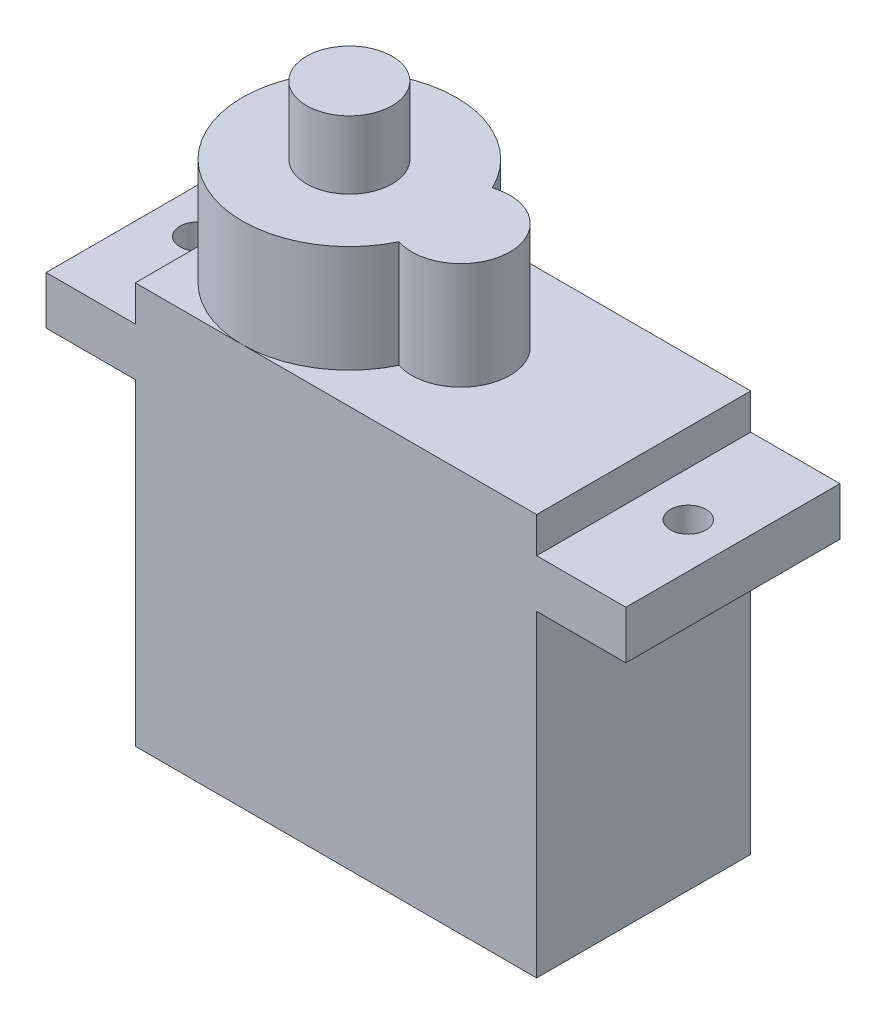
ISO-10303-21;
HEADER;
FILE_DESCRIPTION(('STEP AP214'),'2;1');
FILE_NAME('part.step','',(''),(''),'','','');
FILE_SCHEMA(('AUTOMOTIVE_DESIGN { 1 0 10303 214 1 1 1 1 }'));
ENDSEC;
DATA;
#1=APPLICATION_CONTEXT('core data for automotive mechanical design processes');
#2=APPLICATION_PROTOCOL_DEFINITION('international standard','automotive_design',2000,#1);
#3=PRODUCT_CONTEXT('',#1,'mechanical');
#4=PRODUCT('Part','Part','',(#3));
#5=PRODUCT_RELATED_PRODUCT_CATEGORY('part','',(#4));
#6=PRODUCT_DEFINITION_FORMATION('','',#4);
#7=PRODUCT_DEFINITION_CONTEXT('part definition',#1,'design');
#8=PRODUCT_DEFINITION('design','',#6,#7);
#9=PRODUCT_DEFINITION_SHAPE('','',#8);
#10=(LENGTH_UNIT() NAMED_UNIT(*) SI_UNIT(.MILLI.,.METRE.));
#11=(NAMED_UNIT(*) PLANE_ANGLE_UNIT() SI_UNIT($,.RADIAN.));
#12=(NAMED_UNIT(*) SI_UNIT($,.STERADIAN.) SOLID_ANGLE_UNIT());
#13=UNCERTAINTY_MEASURE_WITH_UNIT(LENGTH_MEASURE(1.E-05),#10,'distance_accuracy_value','');
#14=(GEOMETRIC_REPRESENTATION_CONTEXT(3) GLOBAL_UNCERTAINTY_ASSIGNED_CONTEXT((#13)) GLOBAL_UNIT_ASSIGNED_CONTEXT((#10,
#11,#12)) REPRESENTATION_CONTEXT('',''));
#15=CARTESIAN_POINT('',(0.,0.,0.));
#16=DIRECTION('',(0.,0.,1.));
#17=DIRECTION('',(1.,0.,0.));
#18=AXIS2_PLACEMENT_3D('',#15,#16,#17);
#19=CARTESIAN_POINT('',(11.25,11.25,-12.));
#20=DIRECTION('',(0.,1.,0.));
#21=DIRECTION('',(-1.,0.,0.));
#22=AXIS2_PLACEMENT_3D('',#19,#20,#21);
#23=PLANE('',#22);
#24=CARTESIAN_POINT('',(-5.25,11.25,-6.));
#25=DIRECTION('',(0.,1.,0.));
#26=DIRECTION('',(-1.,0.,0.));
#27=AXIS2_PLACEMENT_3D('',#24,#25,#26);
#28=CIRCLE('',#27,6.);
#29=CARTESIAN_POINT('',(0.150000000000006,11.25,-8.6153393661244));
#30=VERTEX_POINT('',#29);
#31=CARTESIAN_POINT('',(-5.25,11.25,-12.));
#32=VERTEX_POINT('',#31);
#33=EDGE_CURVE('E48',#30,#32,#28,.T.);
#34=ORIENTED_EDGE('',*,*,#33,.F.);
#35=CARTESIAN_POINT('',(1.,11.25,-6.));
#36=DIRECTION('',(0.,1.,0.));
#37=DIRECTION('',(-1.,0.,0.));
#38=AXIS2_PLACEMENT_3D('',#35,#36,#37);
#39=CIRCLE('',#38,2.75);
#40=CARTESIAN_POINT('',(0.150000000000005,11.25,-3.3846606338756));
#41=VERTEX_POINT('',#40);
#42=EDGE_CURVE('E55',#41,#30,#39,.T.);
#43=ORIENTED_EDGE('',*,*,#42,.F.);
#44=CARTESIAN_POINT('',(-5.25,11.25,0.));
#45=VERTEX_POINT('',#44);
#46=EDGE_CURVE('E166',#45,#41,#28,.T.);
#47=ORIENTED_EDGE('',*,*,#46,.F.);
#48=DIRECTION('',(-1.,0.,0.));
#49=VECTOR('',#48,1.);
#50=CARTESIAN_POINT('',(11.25,11.25,0.));
#51=LINE('',#50,#49);
#52=CARTESIAN_POINT('',(11.25,11.25,0.));
#53=VERTEX_POINT('',#52);
#54=EDGE_CURVE('E258',#53,#45,#51,.T.);
#55=ORIENTED_EDGE('',*,*,#54,.F.);
#56=DIRECTION('',(0.,0.,1.));
#57=VECTOR('',#56,1.);
#58=CARTESIAN_POINT('',(11.25,11.25,-12.));
#59=LINE('',#58,#57);
#60=CARTESIAN_POINT('',(11.25,11.25,-12.));
#61=VERTEX_POINT('',#60);
#62=EDGE_CURVE('E265',#61,#53,#59,.T.);
#63=ORIENTED_EDGE('',*,*,#62,.F.);
#64=DIRECTION('',(-1.,0.,0.));
#65=VECTOR('',#64,1.);
#66=CARTESIAN_POINT('',(11.25,11.25,-12.));
#67=LINE('',#66,#65);
#68=EDGE_CURVE('E243',#61,#32,#67,.T.);
#69=ORIENTED_EDGE('',*,*,#68,.T.);
#70=EDGE_LOOP('',(#34,#43,#47,#55,#63,#69));
#71=FACE_BOUND('',#70,.T.);
#72=ADVANCED_FACE('F37',(#71),#23,.T.);
#73=CARTESIAN_POINT('',(-11.25,11.25,-6.));
#74=VERTEX_POINT('',#73);
#75=EDGE_CURVE('E11',#32,#74,#28,.T.);
#76=ORIENTED_EDGE('',*,*,#75,.F.);
#77=CARTESIAN_POINT('',(-11.25,11.25,-12.));
#78=VERTEX_POINT('',#77);
#79=EDGE_CURVE('E242',#32,#78,#67,.T.);
#80=ORIENTED_EDGE('',*,*,#79,.T.);
#81=DIRECTION('',(0.,0.,1.));
#82=VECTOR('',#81,1.);
#83=CARTESIAN_POINT('',(-11.25,11.25,-12.));
#84=LINE('',#83,#82);
#85=EDGE_CURVE('E261',#78,#74,#84,.T.);
#86=ORIENTED_EDGE('',*,*,#85,.T.);
#87=EDGE_LOOP('',(#76,#80,#86));
#88=FACE_BOUND('',#87,.T.);
#89=ADVANCED_FACE('F337',(#88),#23,.T.);
#90=CARTESIAN_POINT('',(-11.25,-11.25,-12.));
#91=DIRECTION('',(-1.,0.,0.));
#92=DIRECTION('',(0.,0.,1.));
#93=AXIS2_PLACEMENT_3D('',#90,#91,#92);
#94=PLANE('',#93);
#95=DIRECTION('',(0.,-1.,0.));
#96=VECTOR('',#95,1.);
#97=CARTESIAN_POINT('',(-11.25,-11.25,0.));
#98=LINE('',#97,#96);
#99=CARTESIAN_POINT('',(-11.25,6.54999999999999,0.));
#100=VERTEX_POINT('',#99);
#101=CARTESIAN_POINT('',(-11.25,-11.25,0.));
#102=VERTEX_POINT('',#101);
#103=EDGE_CURVE('E231',#100,#102,#98,.T.);
#104=ORIENTED_EDGE('',*,*,#103,.F.);
#105=DIRECTION('',(0.,0.,-1.));
#106=VECTOR('',#105,1.);
#107=CARTESIAN_POINT('',(-11.25,6.55,0.));
#108=LINE('',#107,#106);
#109=CARTESIAN_POINT('',(-11.25,6.55,-12.));
#110=VERTEX_POINT('',#109);
#111=EDGE_CURVE('E187',#100,#110,#108,.T.);
#112=ORIENTED_EDGE('',*,*,#111,.T.);
#113=DIRECTION('',(0.,-1.,0.));
#114=VECTOR('',#113,1.);
#115=CARTESIAN_POINT('',(-11.25,-11.25,-12.));
#116=LINE('',#115,#114);
#117=CARTESIAN_POINT('',(-11.25,-11.25,-12.));
#118=VERTEX_POINT('',#117);
#119=EDGE_CURVE('E236',#110,#118,#116,.T.);
#120=ORIENTED_EDGE('',*,*,#119,.T.);
#121=DIRECTION('',(0.,0.,1.));
#122=VECTOR('',#121,1.);
#123=CARTESIAN_POINT('',(-11.25,-11.25,-12.));
#124=LINE('',#123,#122);
#125=EDGE_CURVE('E246',#118,#102,#124,.T.);
#126=ORIENTED_EDGE('',*,*,#125,.T.);
#127=EDGE_LOOP('',(#104,#112,#120,#126));
#128=FACE_BOUND('',#127,.T.);
#129=ADVANCED_FACE('F39',(#128),#94,.T.);
#130=CARTESIAN_POINT('',(-11.25,9.24999999999999,-12.));
#131=VERTEX_POINT('',#130);
#132=EDGE_CURVE('E232',#78,#131,#116,.T.);
#133=ORIENTED_EDGE('',*,*,#132,.T.);
#134=DIRECTION('',(0.,0.,1.));
#135=VECTOR('',#134,1.);
#136=CARTESIAN_POINT('',(-11.25,9.25,0.));
#137=LINE('',#136,#135);
#138=CARTESIAN_POINT('',(-11.25,9.24999999999998,0.));
#139=VERTEX_POINT('',#138);
#140=EDGE_CURVE('E179',#131,#139,#137,.T.);
#141=ORIENTED_EDGE('',*,*,#140,.T.);
#142=CARTESIAN_POINT('',(-11.25,11.25,0.));
#143=VERTEX_POINT('',#142);
#144=EDGE_CURVE('E247',#143,#139,#98,.T.);
#145=ORIENTED_EDGE('',*,*,#144,.F.);
#146=EDGE_CURVE('E264',#74,#143,#84,.T.);
#147=ORIENTED_EDGE('',*,*,#146,.F.);
#148=ORIENTED_EDGE('',*,*,#85,.F.);
#149=EDGE_LOOP('',(#133,#141,#145,#147,#148));
#150=FACE_BOUND('',#149,.T.);
#151=ADVANCED_FACE('F351',(#150),#94,.T.);
#152=CARTESIAN_POINT('',(11.25,-11.25,-12.));
#153=DIRECTION('',(1.,0.,0.));
#154=DIRECTION('',(0.,0.,-1.));
#155=AXIS2_PLACEMENT_3D('',#152,#153,#154);
#156=PLANE('',#155);
#157=DIRECTION('',(0.,0.,1.));
#158=VECTOR('',#157,1.);
#159=CARTESIAN_POINT('',(11.25,9.25,0.));
#160=LINE('',#159,#158);
#161=CARTESIAN_POINT('',(11.25,9.24999999999999,-12.));
#162=VERTEX_POINT('',#161);
#163=CARTESIAN_POINT('',(11.25,9.24999999999999,0.));
#164=VERTEX_POINT('',#163);
#165=EDGE_CURVE('E208',#162,#164,#160,.T.);
#166=ORIENTED_EDGE('',*,*,#165,.F.);
#167=DIRECTION('',(0.,1.,0.));
#168=VECTOR('',#167,1.);
#169=CARTESIAN_POINT('',(11.25,-11.25,-12.));
#170=LINE('',#169,#168);
#171=EDGE_CURVE('E239',#162,#61,#170,.T.);
#172=ORIENTED_EDGE('',*,*,#171,.T.);
#173=ORIENTED_EDGE('',*,*,#62,.T.);
#174=DIRECTION('',(0.,1.,0.));
#175=VECTOR('',#174,1.);
#176=CARTESIAN_POINT('',(11.25,-11.25,0.));
#177=LINE('',#176,#175);
#178=EDGE_CURVE('E253',#164,#53,#177,.T.);
#179=ORIENTED_EDGE('',*,*,#178,.F.);
#180=EDGE_LOOP('',(#166,#172,#173,#179));
#181=FACE_BOUND('',#180,.T.);
#182=ADVANCED_FACE('F308',(#181),#156,.T.);
#183=EDGE_CURVE('E46',#74,#45,#28,.T.);
#184=ORIENTED_EDGE('',*,*,#183,.F.);
#185=ORIENTED_EDGE('',*,*,#146,.T.);
#186=EDGE_CURVE('E257',#45,#143,#51,.T.);
#187=ORIENTED_EDGE('',*,*,#186,.F.);
#188=EDGE_LOOP('',(#184,#185,#187));
#189=FACE_BOUND('',#188,.T.);
#190=ADVANCED_FACE('F339',(#189),#23,.T.);
#191=DIRECTION('',(0.,0.,-1.));
#192=VECTOR('',#191,1.);
#193=CARTESIAN_POINT('',(11.25,6.55,0.));
#194=LINE('',#193,#192);
#195=CARTESIAN_POINT('',(11.25,6.54999999999999,0.));
#196=VERTEX_POINT('',#195);
#197=CARTESIAN_POINT('',(11.25,6.55,-12.));
#198=VERTEX_POINT('',#197);
#199=EDGE_CURVE('E215',#196,#198,#194,.T.);
#200=ORIENTED_EDGE('',*,*,#199,.F.);
#201=CARTESIAN_POINT('',(11.25,-11.25,0.));
#202=VERTEX_POINT('',#201);
#203=EDGE_CURVE('E254',#202,#196,#177,.T.);
#204=ORIENTED_EDGE('',*,*,#203,.F.);
#205=DIRECTION('',(0.,0.,1.));
#206=VECTOR('',#205,1.);
#207=CARTESIAN_POINT('',(11.25,-11.25,-12.));
#208=LINE('',#207,#206);
#209=CARTESIAN_POINT('',(11.25,-11.25,-12.));
#210=VERTEX_POINT('',#209);
#211=EDGE_CURVE('E268',#210,#202,#208,.T.);
#212=ORIENTED_EDGE('',*,*,#211,.F.);
#213=EDGE_CURVE('E240',#210,#198,#170,.T.);
#214=ORIENTED_EDGE('',*,*,#213,.T.);
#215=EDGE_LOOP('',(#200,#204,#212,#214));
#216=FACE_BOUND('',#215,.T.);
#217=ADVANCED_FACE('F295',(#216),#156,.T.);
#218=CARTESIAN_POINT('',(11.25,-11.25,-12.));
#219=DIRECTION('',(0.,-1.,0.));
#220=DIRECTION('',(1.,0.,0.));
#221=AXIS2_PLACEMENT_3D('',#218,#219,#220);
#222=PLANE('',#221);
#223=DIRECTION('',(1.,0.,0.));
#224=VECTOR('',#223,1.);
#225=CARTESIAN_POINT('',(11.25,-11.25,0.));
#226=LINE('',#225,#224);
#227=EDGE_CURVE('E250',#102,#202,#226,.T.);
#228=ORIENTED_EDGE('',*,*,#227,.F.);
#229=ORIENTED_EDGE('',*,*,#125,.F.);
#230=DIRECTION('',(1.,0.,0.));
#231=VECTOR('',#230,1.);
#232=CARTESIAN_POINT('',(11.25,-11.25,-12.));
#233=LINE('',#232,#231);
#234=EDGE_CURVE('E235',#118,#210,#233,.T.);
#235=ORIENTED_EDGE('',*,*,#234,.T.);
#236=ORIENTED_EDGE('',*,*,#211,.T.);
#237=EDGE_LOOP('',(#228,#229,#235,#236));
#238=FACE_BOUND('',#237,.T.);
#239=ADVANCED_FACE('F277',(#238),#222,.T.);
#240=CARTESIAN_POINT('',(0.,0.,-12.));
#241=DIRECTION('',(0.,0.,1.));
#242=DIRECTION('',(1.,0.,0.));
#243=AXIS2_PLACEMENT_3D('',#240,#241,#242);
#244=PLANE('',#243);
#245=DIRECTION('',(-1.,0.,0.));
#246=VECTOR('',#245,1.);
#247=CARTESIAN_POINT('',(16.25,6.55,-12.));
#248=LINE('',#247,#246);
#249=CARTESIAN_POINT('',(16.25,6.55,-12.));
#250=VERTEX_POINT('',#249);
#251=EDGE_CURVE('E225',#250,#198,#248,.T.);
#252=ORIENTED_EDGE('',*,*,#251,.T.);
#253=ORIENTED_EDGE('',*,*,#213,.F.);
#254=ORIENTED_EDGE('',*,*,#234,.F.);
#255=ORIENTED_EDGE('',*,*,#119,.F.);
#256=DIRECTION('',(1.,0.,0.));
#257=VECTOR('',#256,1.);
#258=CARTESIAN_POINT('',(-16.25,6.55,-12.));
#259=LINE('',#258,#257);
#260=CARTESIAN_POINT('',(-16.25,6.55,-12.));
#261=VERTEX_POINT('',#260);
#262=EDGE_CURVE('E195',#261,#110,#259,.T.);
#263=ORIENTED_EDGE('',*,*,#262,.F.);
#264=DIRECTION('',(0.,1.,0.));
#265=VECTOR('',#264,1.);
#266=CARTESIAN_POINT('',(-16.25,9.25,-12.));
#267=LINE('',#266,#265);
#268=CARTESIAN_POINT('',(-16.25,9.25,-12.));
#269=VERTEX_POINT('',#268);
#270=EDGE_CURVE('E181',#261,#269,#267,.T.);
#271=ORIENTED_EDGE('',*,*,#270,.T.);
#272=DIRECTION('',(1.,0.,0.));
#273=VECTOR('',#272,1.);
#274=CARTESIAN_POINT('',(-16.25,9.25,-12.));
#275=LINE('',#274,#273);
#276=EDGE_CURVE('E193',#269,#131,#275,.T.);
#277=ORIENTED_EDGE('',*,*,#276,.T.);
#278=ORIENTED_EDGE('',*,*,#132,.F.);
#279=ORIENTED_EDGE('',*,*,#79,.F.);
#280=ORIENTED_EDGE('',*,*,#68,.F.);
#281=ORIENTED_EDGE('',*,*,#171,.F.);
#282=DIRECTION('',(-1.,0.,0.));
#283=VECTOR('',#282,1.);
#284=CARTESIAN_POINT('',(16.25,9.25,-12.));
#285=LINE('',#284,#283);
#286=CARTESIAN_POINT('',(16.25,9.25,-12.));
#287=VERTEX_POINT('',#286);
#288=EDGE_CURVE('E222',#287,#162,#285,.T.);
#289=ORIENTED_EDGE('',*,*,#288,.F.);
#290=DIRECTION('',(0.,1.,0.));
#291=VECTOR('',#290,1.);
#292=CARTESIAN_POINT('',(16.25,9.25,-12.));
#293=LINE('',#292,#291);
#294=EDGE_CURVE('E210',#250,#287,#293,.T.);
#295=ORIENTED_EDGE('',*,*,#294,.F.);
#296=EDGE_LOOP('',(#252,#253,#254,#255,#263,#271,#277,#278,#279,#280,#281,#289,#295));
#297=FACE_BOUND('',#296,.T.);
#298=ADVANCED_FACE('F290',(#297),#244,.F.);
#299=CARTESIAN_POINT('',(0.,0.,0.));
#300=DIRECTION('',(0.,0.,1.));
#301=DIRECTION('',(1.,0.,0.));
#302=AXIS2_PLACEMENT_3D('',#299,#300,#301);
#303=PLANE('',#302);
#304=DIRECTION('',(-1.,0.,0.));
#305=VECTOR('',#304,1.);
#306=CARTESIAN_POINT('',(16.25,9.25,0.));
#307=LINE('',#306,#305);
#308=CARTESIAN_POINT('',(16.25,9.25,0.));
#309=VERTEX_POINT('',#308);
#310=EDGE_CURVE('E214',#309,#164,#307,.T.);
#311=ORIENTED_EDGE('',*,*,#310,.T.);
#312=ORIENTED_EDGE('',*,*,#178,.T.);
#313=ORIENTED_EDGE('',*,*,#54,.T.);
#314=ORIENTED_EDGE('',*,*,#186,.T.);
#315=ORIENTED_EDGE('',*,*,#144,.T.);
#316=DIRECTION('',(1.,0.,0.));
#317=VECTOR('',#316,1.);
#318=CARTESIAN_POINT('',(-16.25,9.25,0.));
#319=LINE('',#318,#317);
#320=CARTESIAN_POINT('',(-16.25,9.25,0.));
#321=VERTEX_POINT('',#320);
#322=EDGE_CURVE('E186',#321,#139,#319,.T.);
#323=ORIENTED_EDGE('',*,*,#322,.F.);
#324=DIRECTION('',(0.,-1.,0.));
#325=VECTOR('',#324,1.);
#326=CARTESIAN_POINT('',(-16.25,9.25,0.));
#327=LINE('',#326,#325);
#328=CARTESIAN_POINT('',(-16.25,6.55,0.));
#329=VERTEX_POINT('',#328);
#330=EDGE_CURVE('E175',#321,#329,#327,.T.);
#331=ORIENTED_EDGE('',*,*,#330,.T.);
#332=DIRECTION('',(1.,0.,0.));
#333=VECTOR('',#332,1.);
#334=CARTESIAN_POINT('',(-16.25,6.55,0.));
#335=LINE('',#334,#333);
#336=EDGE_CURVE('E197',#329,#100,#335,.T.);
#337=ORIENTED_EDGE('',*,*,#336,.T.);
#338=ORIENTED_EDGE('',*,*,#103,.T.);
#339=ORIENTED_EDGE('',*,*,#227,.T.);
#340=ORIENTED_EDGE('',*,*,#203,.T.);
#341=DIRECTION('',(-1.,0.,0.));
#342=VECTOR('',#341,1.);
#343=CARTESIAN_POINT('',(16.25,6.55,0.));
#344=LINE('',#343,#342);
#345=CARTESIAN_POINT('',(16.25,6.55,0.));
#346=VERTEX_POINT('',#345);
#347=EDGE_CURVE('E228',#346,#196,#344,.T.);
#348=ORIENTED_EDGE('',*,*,#347,.F.);
#349=DIRECTION('',(0.,-1.,0.));
#350=VECTOR('',#349,1.);
#351=CARTESIAN_POINT('',(16.25,9.25,0.));
#352=LINE('',#351,#350);
#353=EDGE_CURVE('E204',#309,#346,#352,.T.);
#354=ORIENTED_EDGE('',*,*,#353,.F.);
#355=EDGE_LOOP('',(#311,#312,#313,#314,#315,#323,#331,#337,#338,#339,#340,#348,#354));
#356=FACE_BOUND('',#355,.T.);
#357=ADVANCED_FACE('F280',(#356),#303,.T.);
#358=CARTESIAN_POINT('',(16.25,6.55,0.));
#359=DIRECTION('',(0.,1.,0.));
#360=DIRECTION('',(0.,0.,1.));
#361=AXIS2_PLACEMENT_3D('',#358,#359,#360);
#362=PLANE('',#361);
#363=CARTESIAN_POINT('',(13.75,6.55,-6.));
#364=DIRECTION('',(0.,1.,0.));
#365=DIRECTION('',(0.,0.,1.));
#366=AXIS2_PLACEMENT_3D('',#363,#364,#365);
#367=CIRCLE('',#366,1.);
#368=CARTESIAN_POINT('',(13.75,6.55,-5.));
#369=VERTEX_POINT('',#368);
#370=EDGE_CURVE('E199',#369,#369,#367,.F.);
#371=ORIENTED_EDGE('',*,*,#370,.F.);
#372=EDGE_LOOP('',(#371));
#373=FACE_BOUND('',#372,.T.);
#374=ORIENTED_EDGE('',*,*,#199,.T.);
#375=ORIENTED_EDGE('',*,*,#251,.F.);
#376=DIRECTION('',(0.,0.,-1.));
#377=VECTOR('',#376,1.);
#378=CARTESIAN_POINT('',(16.25,6.55,0.));
#379=LINE('',#378,#377);
#380=EDGE_CURVE('E207',#346,#250,#379,.T.);
#381=ORIENTED_EDGE('',*,*,#380,.F.);
#382=ORIENTED_EDGE('',*,*,#347,.T.);
#383=EDGE_LOOP('',(#374,#375,#381,#382));
#384=FACE_BOUND('',#383,.T.);
#385=ADVANCED_FACE('F297',(#373,#384),#362,.F.);
#386=CARTESIAN_POINT('',(16.25,9.25,0.));
#387=DIRECTION('',(0.,-1.,0.));
#388=DIRECTION('',(0.,0.,-1.));
#389=AXIS2_PLACEMENT_3D('',#386,#387,#388);
#390=PLANE('',#389);
#391=CARTESIAN_POINT('',(13.75,9.25,-6.));
#392=DIRECTION('',(0.,-1.,0.));
#393=DIRECTION('',(0.,0.,-1.));
#394=AXIS2_PLACEMENT_3D('',#391,#392,#393);
#395=CIRCLE('',#394,1.);
#396=CARTESIAN_POINT('',(13.75,9.25,-7.));
#397=VERTEX_POINT('',#396);
#398=EDGE_CURVE('E41',#397,#397,#395,.F.);
#399=ORIENTED_EDGE('',*,*,#398,.F.);
#400=EDGE_LOOP('',(#399));
#401=FACE_BOUND('',#400,.T.);
#402=ORIENTED_EDGE('',*,*,#165,.T.);
#403=ORIENTED_EDGE('',*,*,#310,.F.);
#404=DIRECTION('',(0.,0.,1.));
#405=VECTOR('',#404,1.);
#406=CARTESIAN_POINT('',(16.25,9.25,0.));
#407=LINE('',#406,#405);
#408=EDGE_CURVE('E212',#287,#309,#407,.T.);
#409=ORIENTED_EDGE('',*,*,#408,.F.);
#410=ORIENTED_EDGE('',*,*,#288,.T.);
#411=EDGE_LOOP('',(#402,#403,#409,#410));
#412=FACE_BOUND('',#411,.T.);
#413=ADVANCED_FACE('F305',(#401,#412),#390,.F.);
#414=CARTESIAN_POINT('',(16.25,0.,0.));
#415=DIRECTION('',(1.,0.,0.));
#416=DIRECTION('',(0.,0.,-1.));
#417=AXIS2_PLACEMENT_3D('',#414,#415,#416);
#418=PLANE('',#417);
#419=ORIENTED_EDGE('',*,*,#353,.T.);
#420=ORIENTED_EDGE('',*,*,#380,.T.);
#421=ORIENTED_EDGE('',*,*,#294,.T.);
#422=ORIENTED_EDGE('',*,*,#408,.T.);
#423=EDGE_LOOP('',(#419,#420,#421,#422));
#424=FACE_BOUND('',#423,.T.);
#425=ADVANCED_FACE('F301',(#424),#418,.T.);
#426=CARTESIAN_POINT('',(13.75,11.25,-6.));
#427=DIRECTION('',(0.,-1.,0.));
#428=DIRECTION('',(0.,0.,-1.));
#429=AXIS2_PLACEMENT_3D('',#426,#427,#428);
#430=CYLINDRICAL_SURFACE('',#429,1.);
#431=ORIENTED_EDGE('',*,*,#370,.T.);
#432=EDGE_LOOP('',(#431));
#433=FACE_BOUND('',#432,.T.);
#434=ORIENTED_EDGE('',*,*,#398,.T.);
#435=EDGE_LOOP('',(#434));
#436=FACE_BOUND('',#435,.T.);
#437=ADVANCED_FACE('F373',(#433,#436),#430,.F.);
#438=CARTESIAN_POINT('',(-16.25,6.55,0.));
#439=DIRECTION('',(0.,1.,0.));
#440=DIRECTION('',(0.,0.,1.));
#441=AXIS2_PLACEMENT_3D('',#438,#439,#440);
#442=PLANE('',#441);
#443=CARTESIAN_POINT('',(-13.75,6.55,-6.));
#444=DIRECTION('',(0.,-1.,0.));
#445=DIRECTION('',(0.,0.,1.));
#446=AXIS2_PLACEMENT_3D('',#443,#444,#445);
#447=CIRCLE('',#446,1.);
#448=CARTESIAN_POINT('',(-13.75,6.55,-5.));
#449=VERTEX_POINT('',#448);
#450=EDGE_CURVE('E167',#449,#449,#447,.F.);
#451=ORIENTED_EDGE('',*,*,#450,.T.);
#452=EDGE_LOOP('',(#451));
#453=FACE_BOUND('',#452,.T.);
#454=ORIENTED_EDGE('',*,*,#111,.F.);
#455=ORIENTED_EDGE('',*,*,#336,.F.);
#456=DIRECTION('',(0.,0.,-1.));
#457=VECTOR('',#456,1.);
#458=CARTESIAN_POINT('',(-16.25,6.55,0.));
#459=LINE('',#458,#457);
#460=EDGE_CURVE('E178',#329,#261,#459,.T.);
#461=ORIENTED_EDGE('',*,*,#460,.T.);
#462=ORIENTED_EDGE('',*,*,#262,.T.);
#463=EDGE_LOOP('',(#454,#455,#461,#462));
#464=FACE_BOUND('',#463,.T.);
#465=ADVANCED_FACE('F287',(#453,#464),#442,.F.);
#466=CARTESIAN_POINT('',(-16.25,9.25,0.));
#467=DIRECTION('',(0.,-1.,0.));
#468=DIRECTION('',(0.,0.,-1.));
#469=AXIS2_PLACEMENT_3D('',#466,#467,#468);
#470=PLANE('',#469);
#471=CARTESIAN_POINT('',(-13.75,9.25,-6.));
#472=DIRECTION('',(0.,1.,0.));
#473=DIRECTION('',(0.,0.,-1.));
#474=AXIS2_PLACEMENT_3D('',#471,#472,#473);
#475=CIRCLE('',#474,1.);
#476=CARTESIAN_POINT('',(-13.75,9.25,-7.));
#477=VERTEX_POINT('',#476);
#478=EDGE_CURVE('E170',#477,#477,#475,.F.);
#479=ORIENTED_EDGE('',*,*,#478,.T.);
#480=EDGE_LOOP('',(#479));
#481=FACE_BOUND('',#480,.T.);
#482=ORIENTED_EDGE('',*,*,#140,.F.);
#483=ORIENTED_EDGE('',*,*,#276,.F.);
#484=DIRECTION('',(0.,0.,1.));
#485=VECTOR('',#484,1.);
#486=CARTESIAN_POINT('',(-16.25,9.25,0.));
#487=LINE('',#486,#485);
#488=EDGE_CURVE('E184',#269,#321,#487,.T.);
#489=ORIENTED_EDGE('',*,*,#488,.T.);
#490=ORIENTED_EDGE('',*,*,#322,.T.);
#491=EDGE_LOOP('',(#482,#483,#489,#490));
#492=FACE_BOUND('',#491,.T.);
#493=ADVANCED_FACE('F379',(#481,#492),#470,.F.);
#494=CARTESIAN_POINT('',(-16.25,0.,0.));
#495=DIRECTION('',(-1.,0.,0.));
#496=DIRECTION('',(0.,0.,-1.));
#497=AXIS2_PLACEMENT_3D('',#494,#495,#496);
#498=PLANE('',#497);
#499=ORIENTED_EDGE('',*,*,#330,.F.);
#500=ORIENTED_EDGE('',*,*,#488,.F.);
#501=ORIENTED_EDGE('',*,*,#270,.F.);
#502=ORIENTED_EDGE('',*,*,#460,.F.);
#503=EDGE_LOOP('',(#499,#500,#501,#502));
#504=FACE_BOUND('',#503,.T.);
#505=ADVANCED_FACE('F383',(#504),#498,.T.);
#506=CARTESIAN_POINT('',(-13.75,11.25,-6.));
#507=DIRECTION('',(0.,-1.,0.));
#508=DIRECTION('',(0.,0.,-1.));
#509=AXIS2_PLACEMENT_3D('',#506,#507,#508);
#510=CYLINDRICAL_SURFACE('',#509,1.);
#511=ORIENTED_EDGE('',*,*,#450,.F.);
#512=EDGE_LOOP('',(#511));
#513=FACE_BOUND('',#512,.T.);
#514=ORIENTED_EDGE('',*,*,#478,.F.);
#515=EDGE_LOOP('',(#514));
#516=FACE_BOUND('',#515,.T.);
#517=ADVANCED_FACE('F387',(#513,#516),#510,.F.);
#518=CARTESIAN_POINT('',(-5.25,17.25,-6.));
#519=DIRECTION('',(0.,-1.,0.));
#520=DIRECTION('',(1.,0.,0.));
#521=AXIS2_PLACEMENT_3D('',#518,#519,#520);
#522=CYLINDRICAL_SURFACE('',#521,6.);
#523=ORIENTED_EDGE('',*,*,#33,.T.);
#524=ORIENTED_EDGE('',*,*,#75,.T.);
#525=ORIENTED_EDGE('',*,*,#183,.T.);
#526=ORIENTED_EDGE('',*,*,#46,.T.);
#527=DIRECTION('',(0.,-1.,0.));
#528=VECTOR('',#527,1.);
#529=CARTESIAN_POINT('',(0.150000000000004,17.25,-3.3846606338756));
#530=LINE('',#529,#528);
#531=CARTESIAN_POINT('',(0.150000000000004,17.25,-3.3846606338756));
#532=VERTEX_POINT('',#531);
#533=EDGE_CURVE('E154',#532,#41,#530,.T.);
#534=ORIENTED_EDGE('',*,*,#533,.F.);
#535=CARTESIAN_POINT('',(-5.25,17.25,-6.));
#536=DIRECTION('',(0.,1.,0.));
#537=DIRECTION('',(-1.,0.,0.));
#538=AXIS2_PLACEMENT_3D('',#535,#536,#537);
#539=CIRCLE('',#538,6.);
#540=CARTESIAN_POINT('',(0.150000000000005,17.25,-8.6153393661244));
#541=VERTEX_POINT('',#540);
#542=EDGE_CURVE('E159',#541,#532,#539,.T.);
#543=ORIENTED_EDGE('',*,*,#542,.F.);
#544=DIRECTION('',(0.,-1.,0.));
#545=VECTOR('',#544,1.);
#546=CARTESIAN_POINT('',(0.150000000000005,17.25,-8.6153393661244));
#547=LINE('',#546,#545);
#548=EDGE_CURVE('E156',#541,#30,#547,.T.);
#549=ORIENTED_EDGE('',*,*,#548,.T.);
#550=EDGE_LOOP('',(#523,#524,#525,#526,#534,#543,#549));
#551=FACE_BOUND('',#550,.T.);
#552=ADVANCED_FACE('F165',(#551),#522,.T.);
#553=CARTESIAN_POINT('',(1.,17.25,-6.));
#554=DIRECTION('',(0.,-1.,0.));
#555=DIRECTION('',(1.,0.,0.));
#556=AXIS2_PLACEMENT_3D('',#553,#554,#555);
#557=CYLINDRICAL_SURFACE('',#556,2.75);
#558=ORIENTED_EDGE('',*,*,#42,.T.);
#559=ORIENTED_EDGE('',*,*,#548,.F.);
#560=CARTESIAN_POINT('',(1.,17.25,-6.));
#561=DIRECTION('',(0.,1.,0.));
#562=DIRECTION('',(-1.,0.,0.));
#563=AXIS2_PLACEMENT_3D('',#560,#561,#562);
#564=CIRCLE('',#563,2.75);
#565=EDGE_CURVE('E150',#532,#541,#564,.T.);
#566=ORIENTED_EDGE('',*,*,#565,.F.);
#567=ORIENTED_EDGE('',*,*,#533,.T.);
#568=EDGE_LOOP('',(#558,#559,#566,#567));
#569=FACE_BOUND('',#568,.T.);
#570=ADVANCED_FACE('F152',(#569),#557,.T.);
#571=CARTESIAN_POINT('',(-2.125,17.25,-6.));
#572=DIRECTION('',(0.,1.,0.));
#573=DIRECTION('',(-1.,0.,0.));
#574=AXIS2_PLACEMENT_3D('',#571,#572,#573);
#575=PLANE('',#574);
#576=CARTESIAN_POINT('',(-5.25,17.25,-6.));
#577=DIRECTION('',(0.,1.,0.));
#578=DIRECTION('',(-1.,0.,0.));
#579=AXIS2_PLACEMENT_3D('',#576,#577,#578);
#580=CIRCLE('',#579,2.4);
#581=CARTESIAN_POINT('',(-2.85,17.25,-6.));
#582=VERTEX_POINT('',#581);
#583=EDGE_CURVE('E316',#582,#582,#580,.T.);
#584=ORIENTED_EDGE('',*,*,#583,.F.);
#585=EDGE_LOOP('',(#584));
#586=FACE_BOUND('',#585,.T.);
#587=ORIENTED_EDGE('',*,*,#542,.T.);
#588=ORIENTED_EDGE('',*,*,#565,.T.);
#589=EDGE_LOOP('',(#587,#588));
#590=FACE_BOUND('',#589,.T.);
#591=ADVANCED_FACE('F161',(#586,#590),#575,.T.);
#592=CARTESIAN_POINT('',(-5.25,21.05,-6.));
#593=DIRECTION('',(0.,-1.,0.));
#594=DIRECTION('',(1.,0.,0.));
#595=AXIS2_PLACEMENT_3D('',#592,#593,#594);
#596=CYLINDRICAL_SURFACE('',#595,2.4);
#597=CARTESIAN_POINT('',(-5.25,21.05,-6.));
#598=DIRECTION('',(0.,1.,0.));
#599=DIRECTION('',(-1.,0.,0.));
#600=AXIS2_PLACEMENT_3D('',#597,#598,#599);
#601=CIRCLE('',#600,2.4);
#602=CARTESIAN_POINT('',(-2.85,21.05,-6.));
#603=VERTEX_POINT('',#602);
#604=EDGE_CURVE('E314',#603,#603,#601,.T.);
#605=CARTESIAN_POINT('',(-2.85,21.05,-6.));
#606=CARTESIAN_POINT('',(-2.85,21.0104166666667,-6.));
#607=CARTESIAN_POINT('',(-2.85,20.9708333333333,-6.));
#608=CARTESIAN_POINT('',(-2.85,20.8916666666667,-6.));
#609=CARTESIAN_POINT('',(-2.85,20.8520833333333,-6.));
#610=CARTESIAN_POINT('',(-2.85,20.7729166666667,-6.));
#611=CARTESIAN_POINT('',(-2.85,20.7333333333333,-6.));
#612=CARTESIAN_POINT('',(-2.85,20.6541666666667,-6.));
#613=CARTESIAN_POINT('',(-2.85,20.6145833333333,-6.));
#614=CARTESIAN_POINT('',(-2.85,20.5354166666667,-6.));
#615=CARTESIAN_POINT('',(-2.85,20.4958333333333,-6.));
#616=CARTESIAN_POINT('',(-2.85,20.4166666666667,-6.));
#617=CARTESIAN_POINT('',(-2.85,20.3770833333333,-6.));
#618=CARTESIAN_POINT('',(-2.85,20.2979166666667,-6.));
#619=CARTESIAN_POINT('',(-2.85,20.2583333333333,-6.));
#620=CARTESIAN_POINT('',(-2.85,20.1791666666667,-6.));
#621=CARTESIAN_POINT('',(-2.85,20.1395833333333,-6.));
#622=CARTESIAN_POINT('',(-2.85,20.0604166666667,-6.));
#623=CARTESIAN_POINT('',(-2.85,20.0208333333333,-6.));
#624=CARTESIAN_POINT('',(-2.85,19.9416666666667,-6.));
#625=CARTESIAN_POINT('',(-2.85,19.9020833333333,-6.));
#626=CARTESIAN_POINT('',(-2.85,19.8229166666667,-6.));
#627=CARTESIAN_POINT('',(-2.85,19.7833333333333,-6.));
#628=CARTESIAN_POINT('',(-2.85,19.7041666666667,-6.));
#629=CARTESIAN_POINT('',(-2.85,19.6645833333333,-6.));
#630=CARTESIAN_POINT('',(-2.85,19.5854166666667,-6.));
#631=CARTESIAN_POINT('',(-2.85,19.5458333333333,-6.));
#632=CARTESIAN_POINT('',(-2.85,19.4666666666667,-6.));
#633=CARTESIAN_POINT('',(-2.85,19.4270833333333,-6.));
#634=CARTESIAN_POINT('',(-2.85,19.3479166666667,-6.));
#635=CARTESIAN_POINT('',(-2.85,19.3083333333333,-6.));
#636=CARTESIAN_POINT('',(-2.85,19.2291666666667,-6.));
#637=CARTESIAN_POINT('',(-2.85,19.1895833333333,-6.));
#638=CARTESIAN_POINT('',(-2.85,19.1104166666667,-6.));
#639=CARTESIAN_POINT('',(-2.85,19.0708333333333,-6.));
#640=CARTESIAN_POINT('',(-2.85,18.9916666666667,-6.));
#641=CARTESIAN_POINT('',(-2.85,18.9520833333333,-6.));
#642=CARTESIAN_POINT('',(-2.85,18.8729166666667,-6.));
#643=CARTESIAN_POINT('',(-2.85,18.8333333333333,-6.));
#644=CARTESIAN_POINT('',(-2.85,18.7541666666667,-6.));
#645=CARTESIAN_POINT('',(-2.85,18.7145833333333,-6.));
#646=CARTESIAN_POINT('',(-2.85,18.6354166666667,-6.));
#647=CARTESIAN_POINT('',(-2.85,18.5958333333333,-6.));
#648=CARTESIAN_POINT('',(-2.85,18.5166666666667,-6.));
#649=CARTESIAN_POINT('',(-2.85,18.4770833333333,-6.));
#650=CARTESIAN_POINT('',(-2.85,18.3979166666667,-6.));
#651=CARTESIAN_POINT('',(-2.85,18.3583333333333,-6.));
#652=CARTESIAN_POINT('',(-2.85,18.2791666666667,-6.));
#653=CARTESIAN_POINT('',(-2.85,18.2395833333333,-6.));
#654=CARTESIAN_POINT('',(-2.85,18.1604166666667,-6.));
#655=CARTESIAN_POINT('',(-2.85,18.1208333333333,-6.));
#656=CARTESIAN_POINT('',(-2.85,18.0416666666667,-6.));
#657=CARTESIAN_POINT('',(-2.85,18.0020833333333,-6.));
#658=CARTESIAN_POINT('',(-2.85,17.9229166666667,-6.));
#659=CARTESIAN_POINT('',(-2.85,17.8833333333333,-6.));
#660=CARTESIAN_POINT('',(-2.85,17.8041666666667,-6.));
#661=CARTESIAN_POINT('',(-2.85,17.7645833333333,-6.));
#662=CARTESIAN_POINT('',(-2.85,17.6854166666667,-6.));
#663=CARTESIAN_POINT('',(-2.85,17.6458333333333,-6.));
#664=CARTESIAN_POINT('',(-2.85,17.5666666666667,-6.));
#665=CARTESIAN_POINT('',(-2.85,17.5270833333333,-6.));
#666=CARTESIAN_POINT('',(-2.85,17.4479166666667,-6.));
#667=CARTESIAN_POINT('',(-2.85,17.4083333333333,-6.));
#668=CARTESIAN_POINT('',(-2.85,17.3291666666667,-6.));
#669=CARTESIAN_POINT('',(-2.85,17.2895833333333,-6.));
#670=CARTESIAN_POINT('',(-2.85,17.25,-6.));
#671=B_SPLINE_CURVE_WITH_KNOTS('',3,(#605,#606,#607,#608,#609,#610,#611,#612,#613,#614,#615,
#616,#617,#618,#619,#620,#621,#622,#623,#624,#625,#626,#627,#628,#629,#630,#631,#632,#633,#634,
#635,#636,#637,#638,#639,#640,#641,#642,#643,#644,#645,#646,#647,#648,#649,#650,#651,#652,#653,
#654,#655,#656,#657,#658,#659,#660,#661,#662,#663,#664,#665,#666,#667,#668,#669,#670),
.UNSPECIFIED.,.F.,.F.,(4,2,2,2,2,2,2,2,2,2,2,2,2,2,2,2,2,2,2,2,2,2,2,2,2,2,2,2,2,2,2,2,4),(0.,
0.118750000000001,0.237500000000002,0.356250000000002,0.475000000000003,0.593750000000001,
0.712500000000001,0.831250000000002,0.950000000000003,1.06875,1.1875,1.30625,1.425,1.54375,
1.6625,1.78125,1.9,2.01875,2.1375,2.25625,2.375,2.49375,2.6125,2.73125,2.85,2.96875,3.0875,
3.20625,3.325,3.44375,3.5625,3.68125,3.8),.UNSPECIFIED.);
#672=EDGE_CURVE('BSEAM322',#603,#582,#671,.T.);
#673=ORIENTED_EDGE('',*,*,#604,.F.);
#674=ORIENTED_EDGE('',*,*,#583,.T.);
#675=ORIENTED_EDGE('',*,*,#672,.T.);
#676=ORIENTED_EDGE('',*,*,#672,.F.);
#677=EDGE_LOOP('',(#673,#675,#674,#676));
#678=FACE_BOUND('',#677,.T.);
#679=ADVANCED_FACE('F322',(#678),#596,.T.);
#680=CARTESIAN_POINT('',(-5.25,21.05,-6.));
#681=DIRECTION('',(0.,1.,0.));
#682=DIRECTION('',(-1.,0.,0.));
#683=AXIS2_PLACEMENT_3D('',#680,#681,#682);
#684=PLANE('',#683);
#685=ORIENTED_EDGE('',*,*,#604,.T.);
#686=EDGE_LOOP('',(#685));
#687=FACE_BOUND('',#686,.T.);
#688=ADVANCED_FACE('F331',(#687),#684,.T.);
#689=CLOSED_SHELL('',(#72,#89,#129,#151,#182,#190,#217,#239,#298,#357,#385,#413,#425,#437,#465,
#493,#505,#517,#552,#570,#591,#679,#688));
#690=MANIFOLD_SOLID_BREP('B2',#689);
#691=ADVANCED_BREP_SHAPE_REPRESENTATION('',(#18,#690),#14);
#692=SHAPE_DEFINITION_REPRESENTATION(#9,#691);
ENDSEC;
END-ISO-10303-21;
